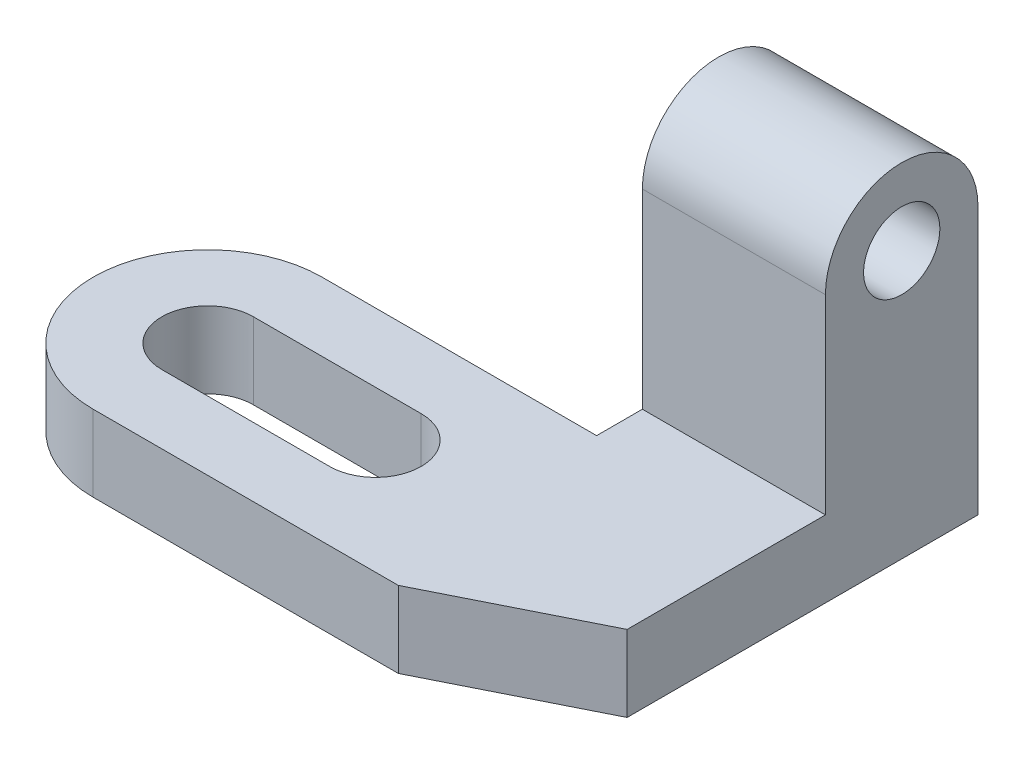
ISO-10303-21;
HEADER;
FILE_DESCRIPTION(('STEP AP214'),'2;1');
FILE_NAME('part.step','',(''),(''),'','','');
FILE_SCHEMA(('AUTOMOTIVE_DESIGN { 1 0 10303 214 1 1 1 1 }'));
ENDSEC;
DATA;
#1=APPLICATION_CONTEXT('core data for automotive mechanical design processes');
#2=APPLICATION_PROTOCOL_DEFINITION('international standard','automotive_design',2000,#1);
#3=PRODUCT_CONTEXT('',#1,'mechanical');
#4=PRODUCT('Part','Part','',(#3));
#5=PRODUCT_RELATED_PRODUCT_CATEGORY('part','',(#4));
#6=PRODUCT_DEFINITION_FORMATION('','',#4);
#7=PRODUCT_DEFINITION_CONTEXT('part definition',#1,'design');
#8=PRODUCT_DEFINITION('design','',#6,#7);
#9=PRODUCT_DEFINITION_SHAPE('','',#8);
#10=(LENGTH_UNIT() NAMED_UNIT(*) SI_UNIT(.MILLI.,.METRE.));
#11=(NAMED_UNIT(*) PLANE_ANGLE_UNIT() SI_UNIT($,.RADIAN.));
#12=(NAMED_UNIT(*) SI_UNIT($,.STERADIAN.) SOLID_ANGLE_UNIT());
#13=UNCERTAINTY_MEASURE_WITH_UNIT(LENGTH_MEASURE(1.E-05),#10,'distance_accuracy_value','');
#14=(GEOMETRIC_REPRESENTATION_CONTEXT(3) GLOBAL_UNCERTAINTY_ASSIGNED_CONTEXT((#13)) GLOBAL_UNIT_ASSIGNED_CONTEXT((#10,
#11,#12)) REPRESENTATION_CONTEXT('',''));
#15=CARTESIAN_POINT('',(0.,0.,0.));
#16=DIRECTION('',(0.,0.,1.));
#17=DIRECTION('',(1.,0.,0.));
#18=AXIS2_PLACEMENT_3D('',#15,#16,#17);
#19=CARTESIAN_POINT('',(0.,10.,0.));
#20=DIRECTION('',(0.,-1.,0.));
#21=DIRECTION('',(0.,0.,-1.));
#22=AXIS2_PLACEMENT_3D('',#19,#20,#21);
#23=PLANE('',#22);
#24=CARTESIAN_POINT('',(0.,10.,0.));
#25=DIRECTION('',(0.,1.,0.));
#26=DIRECTION('',(0.,0.,1.));
#27=AXIS2_PLACEMENT_3D('',#24,#25,#26);
#28=CIRCLE('',#27,6.);
#29=CARTESIAN_POINT('',(0.,10.,-6.));
#30=VERTEX_POINT('',#29);
#31=CARTESIAN_POINT('',(0.,10.,6.));
#32=VERTEX_POINT('',#31);
#33=EDGE_CURVE('E192',#30,#32,#28,.T.);
#34=ORIENTED_EDGE('',*,*,#33,.F.);
#35=DIRECTION('',(-1.,0.,0.));
#36=VECTOR('',#35,1.);
#37=CARTESIAN_POINT('',(0.,10.,-6.));
#38=LINE('',#37,#36);
#39=CARTESIAN_POINT('',(22.,10.,-6.));
#40=VERTEX_POINT('',#39);
#41=EDGE_CURVE('E202',#40,#30,#38,.T.);
#42=ORIENTED_EDGE('',*,*,#41,.F.);
#43=CARTESIAN_POINT('',(22.,10.,0.));
#44=DIRECTION('',(0.,1.,0.));
#45=DIRECTION('',(0.,0.,1.));
#46=AXIS2_PLACEMENT_3D('',#43,#44,#45);
#47=CIRCLE('',#46,6.);
#48=CARTESIAN_POINT('',(22.,10.,6.));
#49=VERTEX_POINT('',#48);
#50=EDGE_CURVE('E199',#49,#40,#47,.T.);
#51=ORIENTED_EDGE('',*,*,#50,.F.);
#52=DIRECTION('',(1.,0.,0.));
#53=VECTOR('',#52,1.);
#54=CARTESIAN_POINT('',(0.,10.,6.));
#55=LINE('',#54,#53);
#56=EDGE_CURVE('E195',#32,#49,#55,.T.);
#57=ORIENTED_EDGE('',*,*,#56,.F.);
#58=EDGE_LOOP('',(#34,#42,#51,#57));
#59=FACE_BOUND('',#58,.T.);
#60=DIRECTION('',(1.,0.,0.));
#61=VECTOR('',#60,1.);
#62=CARTESIAN_POINT('',(-4.31128874149278,10.,-21.));
#63=LINE('',#62,#61);
#64=CARTESIAN_POINT('',(36.,10.,-21.));
#65=VERTEX_POINT('',#64);
#66=CARTESIAN_POINT('',(60.,10.,-21.));
#67=VERTEX_POINT('',#66);
#68=EDGE_CURVE('E61',#65,#67,#63,.T.);
#69=ORIENTED_EDGE('',*,*,#68,.F.);
#70=DIRECTION('',(0.,0.,1.));
#71=VECTOR('',#70,1.);
#72=CARTESIAN_POINT('',(36.,10.,-15.));
#73=LINE('',#72,#71);
#74=CARTESIAN_POINT('',(36.,10.,-15.));
#75=VERTEX_POINT('',#74);
#76=EDGE_CURVE('E247',#65,#75,#73,.T.);
#77=ORIENTED_EDGE('',*,*,#76,.T.);
#78=DIRECTION('',(-1.,0.,0.));
#79=VECTOR('',#78,1.);
#80=CARTESIAN_POINT('',(0.,10.,-15.));
#81=LINE('',#80,#79);
#82=CARTESIAN_POINT('',(0.,10.,-15.));
#83=VERTEX_POINT('',#82);
#84=EDGE_CURVE('E250',#75,#83,#81,.T.);
#85=ORIENTED_EDGE('',*,*,#84,.T.);
#86=CARTESIAN_POINT('',(0.,10.,0.));
#87=DIRECTION('',(0.,1.,0.));
#88=DIRECTION('',(0.,0.,-1.));
#89=AXIS2_PLACEMENT_3D('',#86,#87,#88);
#90=CIRCLE('',#89,15.);
#91=CARTESIAN_POINT('',(0.,10.,15.));
#92=VERTEX_POINT('',#91);
#93=EDGE_CURVE('E233',#83,#92,#90,.T.);
#94=ORIENTED_EDGE('',*,*,#93,.T.);
#95=DIRECTION('',(1.,0.,0.));
#96=VECTOR('',#95,1.);
#97=CARTESIAN_POINT('',(40.,10.,15.));
#98=LINE('',#97,#96);
#99=CARTESIAN_POINT('',(40.,10.,15.));
#100=VERTEX_POINT('',#99);
#101=EDGE_CURVE('E237',#92,#100,#98,.T.);
#102=ORIENTED_EDGE('',*,*,#101,.T.);
#103=DIRECTION('',(0.894427190999916,0.,-0.447213595499958));
#104=VECTOR('',#103,1.);
#105=CARTESIAN_POINT('',(60.,10.,4.99999999999999));
#106=LINE('',#105,#104);
#107=CARTESIAN_POINT('',(60.,10.,4.99999999999999));
#108=VERTEX_POINT('',#107);
#109=EDGE_CURVE('E241',#100,#108,#106,.T.);
#110=ORIENTED_EDGE('',*,*,#109,.T.);
#111=DIRECTION('',(0.,0.,-1.));
#112=VECTOR('',#111,1.);
#113=CARTESIAN_POINT('',(60.,10.,-41.));
#114=LINE('',#113,#112);
#115=EDGE_CURVE('E244',#108,#67,#114,.T.);
#116=ORIENTED_EDGE('',*,*,#115,.T.);
#117=EDGE_LOOP('',(#69,#77,#85,#94,#102,#110,#116));
#118=FACE_BOUND('',#117,.T.);
#119=ADVANCED_FACE('F45',(#59,#118),#23,.F.);
#120=CARTESIAN_POINT('',(0.,0.,0.));
#121=DIRECTION('',(0.,-1.,0.));
#122=DIRECTION('',(0.,0.,-1.));
#123=AXIS2_PLACEMENT_3D('',#120,#121,#122);
#124=PLANE('',#123);
#125=CARTESIAN_POINT('',(0.,0.,0.));
#126=DIRECTION('',(0.,1.,0.));
#127=DIRECTION('',(0.,0.,-1.));
#128=AXIS2_PLACEMENT_3D('',#125,#126,#127);
#129=CIRCLE('',#128,15.);
#130=CARTESIAN_POINT('',(0.,0.,-15.));
#131=VERTEX_POINT('',#130);
#132=CARTESIAN_POINT('',(0.,0.,15.));
#133=VERTEX_POINT('',#132);
#134=EDGE_CURVE('E232',#131,#133,#129,.T.);
#135=ORIENTED_EDGE('',*,*,#134,.F.);
#136=DIRECTION('',(-1.,0.,0.));
#137=VECTOR('',#136,1.);
#138=CARTESIAN_POINT('',(0.,0.,-15.));
#139=LINE('',#138,#137);
#140=CARTESIAN_POINT('',(36.,0.,-15.));
#141=VERTEX_POINT('',#140);
#142=EDGE_CURVE('E238',#141,#131,#139,.T.);
#143=ORIENTED_EDGE('',*,*,#142,.F.);
#144=DIRECTION('',(0.,0.,1.));
#145=VECTOR('',#144,1.);
#146=CARTESIAN_POINT('',(36.,0.,-15.));
#147=LINE('',#146,#145);
#148=CARTESIAN_POINT('',(36.,0.,-41.));
#149=VERTEX_POINT('',#148);
#150=EDGE_CURVE('E268',#149,#141,#147,.T.);
#151=ORIENTED_EDGE('',*,*,#150,.F.);
#152=DIRECTION('',(-1.,0.,0.));
#153=VECTOR('',#152,1.);
#154=CARTESIAN_POINT('',(36.,0.,-41.));
#155=LINE('',#154,#153);
#156=CARTESIAN_POINT('',(60.,0.,-41.));
#157=VERTEX_POINT('',#156);
#158=EDGE_CURVE('E265',#157,#149,#155,.T.);
#159=ORIENTED_EDGE('',*,*,#158,.F.);
#160=DIRECTION('',(0.,0.,-1.));
#161=VECTOR('',#160,1.);
#162=CARTESIAN_POINT('',(60.,0.,-41.));
#163=LINE('',#162,#161);
#164=CARTESIAN_POINT('',(60.,0.,4.99999999999999));
#165=VERTEX_POINT('',#164);
#166=EDGE_CURVE('E150',#165,#157,#163,.T.);
#167=ORIENTED_EDGE('',*,*,#166,.F.);
#168=DIRECTION('',(0.894427190999916,0.,-0.447213595499958));
#169=VECTOR('',#168,1.);
#170=CARTESIAN_POINT('',(60.,0.,4.99999999999999));
#171=LINE('',#170,#169);
#172=CARTESIAN_POINT('',(40.,0.,15.));
#173=VERTEX_POINT('',#172);
#174=EDGE_CURVE('E260',#173,#165,#171,.T.);
#175=ORIENTED_EDGE('',*,*,#174,.F.);
#176=DIRECTION('',(1.,0.,0.));
#177=VECTOR('',#176,1.);
#178=CARTESIAN_POINT('',(40.,0.,15.));
#179=LINE('',#178,#177);
#180=EDGE_CURVE('E257',#133,#173,#179,.T.);
#181=ORIENTED_EDGE('',*,*,#180,.F.);
#182=EDGE_LOOP('',(#135,#143,#151,#159,#167,#175,#181));
#183=FACE_BOUND('',#182,.T.);
#184=DIRECTION('',(-1.,0.,0.));
#185=VECTOR('',#184,1.);
#186=CARTESIAN_POINT('',(0.,0.,-6.));
#187=LINE('',#186,#185);
#188=CARTESIAN_POINT('',(22.,0.,-6.));
#189=VERTEX_POINT('',#188);
#190=CARTESIAN_POINT('',(0.,0.,-6.));
#191=VERTEX_POINT('',#190);
#192=EDGE_CURVE('E196',#189,#191,#187,.T.);
#193=ORIENTED_EDGE('',*,*,#192,.T.);
#194=CARTESIAN_POINT('',(0.,0.,0.));
#195=DIRECTION('',(0.,1.,0.));
#196=DIRECTION('',(0.,0.,1.));
#197=AXIS2_PLACEMENT_3D('',#194,#195,#196);
#198=CIRCLE('',#197,6.);
#199=CARTESIAN_POINT('',(0.,0.,6.));
#200=VERTEX_POINT('',#199);
#201=EDGE_CURVE('E190',#191,#200,#198,.T.);
#202=ORIENTED_EDGE('',*,*,#201,.T.);
#203=DIRECTION('',(1.,0.,0.));
#204=VECTOR('',#203,1.);
#205=CARTESIAN_POINT('',(0.,0.,6.));
#206=LINE('',#205,#204);
#207=CARTESIAN_POINT('',(22.,0.,6.));
#208=VERTEX_POINT('',#207);
#209=EDGE_CURVE('E209',#200,#208,#206,.T.);
#210=ORIENTED_EDGE('',*,*,#209,.T.);
#211=CARTESIAN_POINT('',(22.,0.,0.));
#212=DIRECTION('',(0.,1.,0.));
#213=DIRECTION('',(0.,0.,1.));
#214=AXIS2_PLACEMENT_3D('',#211,#212,#213);
#215=CIRCLE('',#214,6.);
#216=EDGE_CURVE('E213',#208,#189,#215,.T.);
#217=ORIENTED_EDGE('',*,*,#216,.T.);
#218=EDGE_LOOP('',(#193,#202,#210,#217));
#219=FACE_BOUND('',#218,.T.);
#220=ADVANCED_FACE('F294',(#183,#219),#124,.T.);
#221=CARTESIAN_POINT('',(0.,10.,0.));
#222=DIRECTION('',(0.,-1.,0.));
#223=DIRECTION('',(0.,0.,-1.));
#224=AXIS2_PLACEMENT_3D('',#221,#222,#223);
#225=CYLINDRICAL_SURFACE('',#224,15.);
#226=ORIENTED_EDGE('',*,*,#134,.T.);
#227=DIRECTION('',(0.,-1.,0.));
#228=VECTOR('',#227,1.);
#229=CARTESIAN_POINT('',(0.,10.,15.));
#230=LINE('',#229,#228);
#231=EDGE_CURVE('E11',#92,#133,#230,.T.);
#232=ORIENTED_EDGE('',*,*,#231,.F.);
#233=ORIENTED_EDGE('',*,*,#93,.F.);
#234=DIRECTION('',(0.,-1.,0.));
#235=VECTOR('',#234,1.);
#236=CARTESIAN_POINT('',(0.,10.,-15.));
#237=LINE('',#236,#235);
#238=EDGE_CURVE('E253',#83,#131,#237,.T.);
#239=ORIENTED_EDGE('',*,*,#238,.T.);
#240=EDGE_LOOP('',(#226,#232,#233,#239));
#241=FACE_BOUND('',#240,.T.);
#242=ADVANCED_FACE('F47',(#241),#225,.T.);
#243=CARTESIAN_POINT('',(40.,10.,15.));
#244=DIRECTION('',(0.,0.,-1.));
#245=DIRECTION('',(-1.,0.,0.));
#246=AXIS2_PLACEMENT_3D('',#243,#244,#245);
#247=PLANE('',#246);
#248=ORIENTED_EDGE('',*,*,#180,.T.);
#249=DIRECTION('',(0.,-1.,0.));
#250=VECTOR('',#249,1.);
#251=CARTESIAN_POINT('',(40.,10.,15.));
#252=LINE('',#251,#250);
#253=EDGE_CURVE('E54',#100,#173,#252,.T.);
#254=ORIENTED_EDGE('',*,*,#253,.F.);
#255=ORIENTED_EDGE('',*,*,#101,.F.);
#256=ORIENTED_EDGE('',*,*,#231,.T.);
#257=EDGE_LOOP('',(#248,#254,#255,#256));
#258=FACE_BOUND('',#257,.T.);
#259=ADVANCED_FACE('F311',(#258),#247,.F.);
#260=CARTESIAN_POINT('',(60.,10.,4.99999999999999));
#261=DIRECTION('',(-0.447213595499958,0.,-0.894427190999916));
#262=DIRECTION('',(-0.894427190999916,0.,0.447213595499958));
#263=AXIS2_PLACEMENT_3D('',#260,#261,#262);
#264=PLANE('',#263);
#265=ORIENTED_EDGE('',*,*,#174,.T.);
#266=DIRECTION('',(0.,-1.,0.));
#267=VECTOR('',#266,1.);
#268=CARTESIAN_POINT('',(60.,10.,4.99999999999999));
#269=LINE('',#268,#267);
#270=EDGE_CURVE('E154',#108,#165,#269,.T.);
#271=ORIENTED_EDGE('',*,*,#270,.F.);
#272=ORIENTED_EDGE('',*,*,#109,.F.);
#273=ORIENTED_EDGE('',*,*,#253,.T.);
#274=EDGE_LOOP('',(#265,#271,#272,#273));
#275=FACE_BOUND('',#274,.T.);
#276=ADVANCED_FACE('F289',(#275),#264,.F.);
#277=CARTESIAN_POINT('',(60.,10.,-41.));
#278=DIRECTION('',(-1.,0.,0.));
#279=DIRECTION('',(0.,0.,1.));
#280=AXIS2_PLACEMENT_3D('',#277,#278,#279);
#281=PLANE('',#280);
#282=ORIENTED_EDGE('',*,*,#166,.T.);
#283=DIRECTION('',(0.,-1.,0.));
#284=VECTOR('',#283,1.);
#285=CARTESIAN_POINT('',(60.,10.,-41.));
#286=LINE('',#285,#284);
#287=CARTESIAN_POINT('',(60.,35.,-41.));
#288=VERTEX_POINT('',#287);
#289=EDGE_CURVE('E141',#288,#157,#286,.T.);
#290=ORIENTED_EDGE('',*,*,#289,.F.);
#291=CARTESIAN_POINT('',(60.,35.,-31.));
#292=DIRECTION('',(1.,0.,0.));
#293=DIRECTION('',(0.,0.,1.));
#294=AXIS2_PLACEMENT_3D('',#291,#292,#293);
#295=CIRCLE('',#294,10.);
#296=CARTESIAN_POINT('',(60.,35.,-21.));
#297=VERTEX_POINT('',#296);
#298=EDGE_CURVE('E147',#288,#297,#295,.T.);
#299=ORIENTED_EDGE('',*,*,#298,.T.);
#300=DIRECTION('',(0.,-1.,0.));
#301=VECTOR('',#300,1.);
#302=CARTESIAN_POINT('',(60.,10.,-21.));
#303=LINE('',#302,#301);
#304=EDGE_CURVE('E166',#297,#67,#303,.T.);
#305=ORIENTED_EDGE('',*,*,#304,.T.);
#306=ORIENTED_EDGE('',*,*,#115,.F.);
#307=ORIENTED_EDGE('',*,*,#270,.T.);
#308=EDGE_LOOP('',(#282,#290,#299,#305,#306,#307));
#309=FACE_BOUND('',#308,.T.);
#310=CARTESIAN_POINT('',(60.,35.,-31.));
#311=DIRECTION('',(1.,0.,0.));
#312=DIRECTION('',(0.,0.,-1.));
#313=AXIS2_PLACEMENT_3D('',#310,#311,#312);
#314=CIRCLE('',#313,4.99999999999999);
#315=CARTESIAN_POINT('',(60.,35.,-36.));
#316=VERTEX_POINT('',#315);
#317=EDGE_CURVE('E172',#316,#316,#314,.T.);
#318=ORIENTED_EDGE('',*,*,#317,.F.);
#319=EDGE_LOOP('',(#318));
#320=FACE_BOUND('',#319,.T.);
#321=ADVANCED_FACE('F143',(#309,#320),#281,.F.);
#322=CARTESIAN_POINT('',(36.,10.,-41.));
#323=DIRECTION('',(0.,0.,1.));
#324=DIRECTION('',(1.,0.,0.));
#325=AXIS2_PLACEMENT_3D('',#322,#323,#324);
#326=PLANE('',#325);
#327=ORIENTED_EDGE('',*,*,#158,.T.);
#328=DIRECTION('',(0.,-1.,0.));
#329=VECTOR('',#328,1.);
#330=CARTESIAN_POINT('',(36.,10.,-41.));
#331=LINE('',#330,#329);
#332=CARTESIAN_POINT('',(36.,35.,-41.));
#333=VERTEX_POINT('',#332);
#334=EDGE_CURVE('E155',#333,#149,#331,.T.);
#335=ORIENTED_EDGE('',*,*,#334,.F.);
#336=DIRECTION('',(1.,0.,0.));
#337=VECTOR('',#336,1.);
#338=CARTESIAN_POINT('',(-4.31128874149279,35.,-41.));
#339=LINE('',#338,#337);
#340=EDGE_CURVE('E158',#333,#288,#339,.T.);
#341=ORIENTED_EDGE('',*,*,#340,.T.);
#342=ORIENTED_EDGE('',*,*,#289,.T.);
#343=EDGE_LOOP('',(#327,#335,#341,#342));
#344=FACE_BOUND('',#343,.T.);
#345=ADVANCED_FACE('F159',(#344),#326,.F.);
#346=CARTESIAN_POINT('',(36.,10.,-15.));
#347=DIRECTION('',(1.,0.,0.));
#348=DIRECTION('',(0.,0.,-1.));
#349=AXIS2_PLACEMENT_3D('',#346,#347,#348);
#350=PLANE('',#349);
#351=ORIENTED_EDGE('',*,*,#150,.T.);
#352=DIRECTION('',(0.,-1.,0.));
#353=VECTOR('',#352,1.);
#354=CARTESIAN_POINT('',(36.,10.,-15.));
#355=LINE('',#354,#353);
#356=EDGE_CURVE('E276',#75,#141,#355,.T.);
#357=ORIENTED_EDGE('',*,*,#356,.F.);
#358=ORIENTED_EDGE('',*,*,#76,.F.);
#359=DIRECTION('',(0.,1.,0.));
#360=VECTOR('',#359,1.);
#361=CARTESIAN_POINT('',(36.,10.,-21.));
#362=LINE('',#361,#360);
#363=CARTESIAN_POINT('',(36.,35.,-21.));
#364=VERTEX_POINT('',#363);
#365=EDGE_CURVE('E183',#65,#364,#362,.T.);
#366=ORIENTED_EDGE('',*,*,#365,.T.);
#367=CARTESIAN_POINT('',(36.,35.,-31.));
#368=DIRECTION('',(1.,0.,0.));
#369=DIRECTION('',(0.,0.,-1.));
#370=AXIS2_PLACEMENT_3D('',#367,#368,#369);
#371=CIRCLE('',#370,10.);
#372=EDGE_CURVE('E191',#364,#333,#371,.F.);
#373=ORIENTED_EDGE('',*,*,#372,.T.);
#374=ORIENTED_EDGE('',*,*,#334,.T.);
#375=EDGE_LOOP('',(#351,#357,#358,#366,#373,#374));
#376=FACE_BOUND('',#375,.T.);
#377=CARTESIAN_POINT('',(36.,35.,-31.));
#378=DIRECTION('',(1.,0.,0.));
#379=DIRECTION('',(0.,0.,-1.));
#380=AXIS2_PLACEMENT_3D('',#377,#378,#379);
#381=CIRCLE('',#380,4.99999999999999);
#382=CARTESIAN_POINT('',(36.,35.,-36.));
#383=VERTEX_POINT('',#382);
#384=EDGE_CURVE('E186',#383,#383,#381,.F.);
#385=ORIENTED_EDGE('',*,*,#384,.F.);
#386=EDGE_LOOP('',(#385));
#387=FACE_BOUND('',#386,.T.);
#388=ADVANCED_FACE('F299',(#376,#387),#350,.F.);
#389=CARTESIAN_POINT('',(0.,10.,-15.));
#390=DIRECTION('',(0.,0.,1.));
#391=DIRECTION('',(1.,0.,0.));
#392=AXIS2_PLACEMENT_3D('',#389,#390,#391);
#393=PLANE('',#392);
#394=ORIENTED_EDGE('',*,*,#142,.T.);
#395=ORIENTED_EDGE('',*,*,#238,.F.);
#396=ORIENTED_EDGE('',*,*,#84,.F.);
#397=ORIENTED_EDGE('',*,*,#356,.T.);
#398=EDGE_LOOP('',(#394,#395,#396,#397));
#399=FACE_BOUND('',#398,.T.);
#400=ADVANCED_FACE('F315',(#399),#393,.F.);
#401=CARTESIAN_POINT('',(0.,10.,0.));
#402=DIRECTION('',(0.,-1.,0.));
#403=DIRECTION('',(0.,0.,-1.));
#404=AXIS2_PLACEMENT_3D('',#401,#402,#403);
#405=CYLINDRICAL_SURFACE('',#404,6.);
#406=ORIENTED_EDGE('',*,*,#201,.F.);
#407=DIRECTION('',(0.,-1.,0.));
#408=VECTOR('',#407,1.);
#409=CARTESIAN_POINT('',(0.,10.,-6.));
#410=LINE('',#409,#408);
#411=EDGE_CURVE('E205',#30,#191,#410,.T.);
#412=ORIENTED_EDGE('',*,*,#411,.F.);
#413=ORIENTED_EDGE('',*,*,#33,.T.);
#414=DIRECTION('',(0.,-1.,0.));
#415=VECTOR('',#414,1.);
#416=CARTESIAN_POINT('',(0.,10.,6.));
#417=LINE('',#416,#415);
#418=EDGE_CURVE('E228',#32,#200,#417,.T.);
#419=ORIENTED_EDGE('',*,*,#418,.T.);
#420=EDGE_LOOP('',(#406,#412,#413,#419));
#421=FACE_BOUND('',#420,.T.);
#422=ADVANCED_FACE('F318',(#421),#405,.F.);
#423=CARTESIAN_POINT('',(0.,10.,6.));
#424=DIRECTION('',(0.,0.,-1.));
#425=DIRECTION('',(-1.,0.,0.));
#426=AXIS2_PLACEMENT_3D('',#423,#424,#425);
#427=PLANE('',#426);
#428=ORIENTED_EDGE('',*,*,#209,.F.);
#429=ORIENTED_EDGE('',*,*,#418,.F.);
#430=ORIENTED_EDGE('',*,*,#56,.T.);
#431=DIRECTION('',(0.,-1.,0.));
#432=VECTOR('',#431,1.);
#433=CARTESIAN_POINT('',(22.,10.,6.));
#434=LINE('',#433,#432);
#435=EDGE_CURVE('E225',#49,#208,#434,.T.);
#436=ORIENTED_EDGE('',*,*,#435,.T.);
#437=EDGE_LOOP('',(#428,#429,#430,#436));
#438=FACE_BOUND('',#437,.T.);
#439=ADVANCED_FACE('F324',(#438),#427,.T.);
#440=CARTESIAN_POINT('',(22.,10.,0.));
#441=DIRECTION('',(0.,-1.,0.));
#442=DIRECTION('',(0.,0.,-1.));
#443=AXIS2_PLACEMENT_3D('',#440,#441,#442);
#444=CYLINDRICAL_SURFACE('',#443,6.);
#445=ORIENTED_EDGE('',*,*,#216,.F.);
#446=ORIENTED_EDGE('',*,*,#435,.F.);
#447=ORIENTED_EDGE('',*,*,#50,.T.);
#448=DIRECTION('',(0.,-1.,0.));
#449=VECTOR('',#448,1.);
#450=CARTESIAN_POINT('',(22.,10.,-6.));
#451=LINE('',#450,#449);
#452=EDGE_CURVE('E69',#40,#189,#451,.T.);
#453=ORIENTED_EDGE('',*,*,#452,.T.);
#454=EDGE_LOOP('',(#445,#446,#447,#453));
#455=FACE_BOUND('',#454,.T.);
#456=ADVANCED_FACE('F342',(#455),#444,.F.);
#457=CARTESIAN_POINT('',(0.,10.,-6.));
#458=DIRECTION('',(0.,0.,1.));
#459=DIRECTION('',(1.,0.,0.));
#460=AXIS2_PLACEMENT_3D('',#457,#458,#459);
#461=PLANE('',#460);
#462=ORIENTED_EDGE('',*,*,#192,.F.);
#463=ORIENTED_EDGE('',*,*,#452,.F.);
#464=ORIENTED_EDGE('',*,*,#41,.T.);
#465=ORIENTED_EDGE('',*,*,#411,.T.);
#466=EDGE_LOOP('',(#462,#463,#464,#465));
#467=FACE_BOUND('',#466,.T.);
#468=ADVANCED_FACE('F346',(#467),#461,.T.);
#469=CARTESIAN_POINT('',(-4.31128874149279,35.,-31.));
#470=DIRECTION('',(1.,0.,0.));
#471=DIRECTION('',(0.,0.,-1.));
#472=AXIS2_PLACEMENT_3D('',#469,#470,#471);
#473=CYLINDRICAL_SURFACE('',#472,10.);
#474=ORIENTED_EDGE('',*,*,#372,.F.);
#475=DIRECTION('',(1.,0.,0.));
#476=VECTOR('',#475,1.);
#477=CARTESIAN_POINT('',(-4.31128874149278,35.,-21.));
#478=LINE('',#477,#476);
#479=EDGE_CURVE('E165',#364,#297,#478,.T.);
#480=ORIENTED_EDGE('',*,*,#479,.T.);
#481=ORIENTED_EDGE('',*,*,#298,.F.);
#482=ORIENTED_EDGE('',*,*,#340,.F.);
#483=EDGE_LOOP('',(#474,#480,#481,#482));
#484=FACE_BOUND('',#483,.T.);
#485=ADVANCED_FACE('F168',(#484),#473,.T.);
#486=CARTESIAN_POINT('',(-4.31128874149278,10.,-21.));
#487=DIRECTION('',(0.,0.,1.));
#488=DIRECTION('',(1.,0.,0.));
#489=AXIS2_PLACEMENT_3D('',#486,#487,#488);
#490=PLANE('',#489);
#491=ORIENTED_EDGE('',*,*,#365,.F.);
#492=ORIENTED_EDGE('',*,*,#68,.T.);
#493=ORIENTED_EDGE('',*,*,#304,.F.);
#494=ORIENTED_EDGE('',*,*,#479,.F.);
#495=EDGE_LOOP('',(#491,#492,#493,#494));
#496=FACE_BOUND('',#495,.T.);
#497=ADVANCED_FACE('F307',(#496),#490,.T.);
#498=CARTESIAN_POINT('',(-4.31128874149279,35.,-31.));
#499=DIRECTION('',(1.,0.,0.));
#500=DIRECTION('',(0.,0.,-1.));
#501=AXIS2_PLACEMENT_3D('',#498,#499,#500);
#502=CYLINDRICAL_SURFACE('',#501,4.99999999999999);
#503=ORIENTED_EDGE('',*,*,#384,.T.);
#504=EDGE_LOOP('',(#503));
#505=FACE_BOUND('',#504,.T.);
#506=ORIENTED_EDGE('',*,*,#317,.T.);
#507=EDGE_LOOP('',(#506));
#508=FACE_BOUND('',#507,.T.);
#509=ADVANCED_FACE('F353',(#505,#508),#502,.F.);
#510=CLOSED_SHELL('',(#119,#220,#242,#259,#276,#321,#345,#388,#400,#422,#439,#456,#468,#485,
#497,#509));
#511=MANIFOLD_SOLID_BREP('B2',#510);
#512=ADVANCED_BREP_SHAPE_REPRESENTATION('',(#18,#511),#14);
#513=SHAPE_DEFINITION_REPRESENTATION(#9,#512);
ENDSEC;
END-ISO-10303-21;
